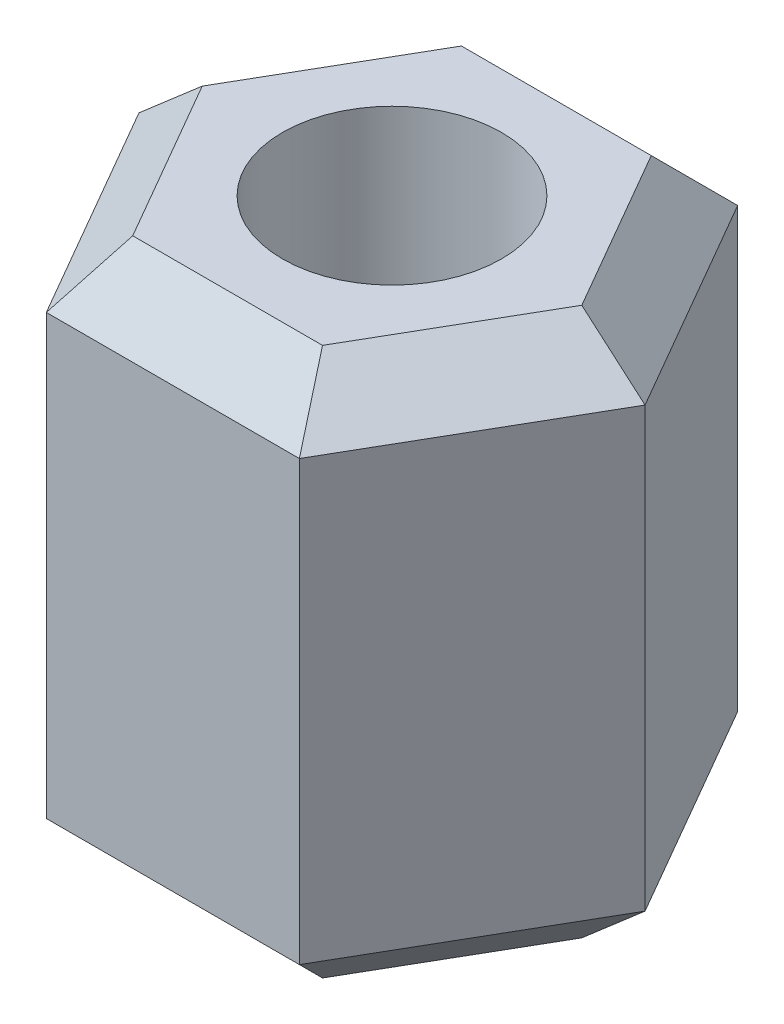
ISO-10303-21;
HEADER;
FILE_DESCRIPTION(('STEP AP214'),'2;1');
FILE_NAME('part.step','',(''),(''),'','','');
FILE_SCHEMA(('AUTOMOTIVE_DESIGN { 1 0 10303 214 1 1 1 1 }'));
ENDSEC;
DATA;
#1=APPLICATION_CONTEXT('core data for automotive mechanical design processes');
#2=APPLICATION_PROTOCOL_DEFINITION('international standard','automotive_design',2000,#1);
#3=PRODUCT_CONTEXT('',#1,'mechanical');
#4=PRODUCT('Part','Part','',(#3));
#5=PRODUCT_RELATED_PRODUCT_CATEGORY('part','',(#4));
#6=PRODUCT_DEFINITION_FORMATION('','',#4);
#7=PRODUCT_DEFINITION_CONTEXT('part definition',#1,'design');
#8=PRODUCT_DEFINITION('design','',#6,#7);
#9=PRODUCT_DEFINITION_SHAPE('','',#8);
#10=(LENGTH_UNIT() NAMED_UNIT(*) SI_UNIT(.MILLI.,.METRE.));
#11=(NAMED_UNIT(*) PLANE_ANGLE_UNIT() SI_UNIT($,.RADIAN.));
#12=(NAMED_UNIT(*) SI_UNIT($,.STERADIAN.) SOLID_ANGLE_UNIT());
#13=UNCERTAINTY_MEASURE_WITH_UNIT(LENGTH_MEASURE(1.E-05),#10,'distance_accuracy_value','');
#14=(GEOMETRIC_REPRESENTATION_CONTEXT(3) GLOBAL_UNCERTAINTY_ASSIGNED_CONTEXT((#13)) GLOBAL_UNIT_ASSIGNED_CONTEXT((#10,
#11,#12)) REPRESENTATION_CONTEXT('',''));
#15=CARTESIAN_POINT('',(0.,0.,0.));
#16=DIRECTION('',(0.,0.,1.));
#17=DIRECTION('',(1.,0.,0.));
#18=AXIS2_PLACEMENT_3D('',#15,#16,#17);
#19=CARTESIAN_POINT('',(0.,5.,0.));
#20=DIRECTION('',(0.,1.,0.));
#21=DIRECTION('',(0.,0.,1.));
#22=AXIS2_PLACEMENT_3D('',#19,#20,#21);
#23=PLANE('',#22);
#24=DIRECTION('',(0.5,0.,-0.866025403784439));
#25=VECTOR('',#24,1.);
#26=CARTESIAN_POINT('',(1.8763883748663,5.,-0.25));
#27=LINE('',#26,#25);
#28=CARTESIAN_POINT('',(0.866025403784449,5.,1.50000000000002));
#29=VERTEX_POINT('',#28);
#30=CARTESIAN_POINT('',(1.7320508075689,5.,0.));
#31=VERTEX_POINT('',#30);
#32=EDGE_CURVE('E203',#29,#31,#27,.T.);
#33=ORIENTED_EDGE('',*,*,#32,.T.);
#34=DIRECTION('',(-0.5,0.,-0.866025403784439));
#35=VECTOR('',#34,1.);
#36=CARTESIAN_POINT('',(0.721687836487043,5.,-1.75000000000002));
#37=LINE('',#36,#35);
#38=CARTESIAN_POINT('',(0.866025403784449,5.,-1.50000000000002));
#39=VERTEX_POINT('',#38);
#40=EDGE_CURVE('E11',#31,#39,#37,.T.);
#41=ORIENTED_EDGE('',*,*,#40,.T.);
#42=DIRECTION('',(-1.,0.,0.));
#43=VECTOR('',#42,1.);
#44=CARTESIAN_POINT('',(-1.15470053837926,5.,-1.50000000000002));
#45=LINE('',#44,#43);
#46=CARTESIAN_POINT('',(-0.866025403784449,5.,-1.50000000000002));
#47=VERTEX_POINT('',#46);
#48=EDGE_CURVE('E47',#39,#47,#45,.T.);
#49=ORIENTED_EDGE('',*,*,#48,.T.);
#50=DIRECTION('',(-0.5,0.,0.866025403784439));
#51=VECTOR('',#50,1.);
#52=CARTESIAN_POINT('',(-1.8763883748663,5.,0.25));
#53=LINE('',#52,#51);
#54=CARTESIAN_POINT('',(-1.7320508075689,5.,0.));
#55=VERTEX_POINT('',#54);
#56=EDGE_CURVE('E209',#47,#55,#53,.T.);
#57=ORIENTED_EDGE('',*,*,#56,.T.);
#58=DIRECTION('',(0.5,0.,0.866025403784439));
#59=VECTOR('',#58,1.);
#60=CARTESIAN_POINT('',(-0.721687836487042,5.,1.75000000000002));
#61=LINE('',#60,#59);
#62=CARTESIAN_POINT('',(-0.866025403784448,5.,1.50000000000002));
#63=VERTEX_POINT('',#62);
#64=EDGE_CURVE('E207',#55,#63,#61,.T.);
#65=ORIENTED_EDGE('',*,*,#64,.T.);
#66=DIRECTION('',(1.,0.,0.));
#67=VECTOR('',#66,1.);
#68=CARTESIAN_POINT('',(1.15470053837926,5.,1.50000000000002));
#69=LINE('',#68,#67);
#70=EDGE_CURVE('E205',#63,#29,#69,.T.);
#71=ORIENTED_EDGE('',*,*,#70,.T.);
#72=EDGE_LOOP('',(#33,#41,#49,#57,#65,#71));
#73=FACE_BOUND('',#72,.T.);
#74=CARTESIAN_POINT('',(0.,5.,0.));
#75=DIRECTION('',(0.,1.,0.));
#76=DIRECTION('',(0.,0.,1.));
#77=AXIS2_PLACEMENT_3D('',#74,#75,#76);
#78=CIRCLE('',#77,1.);
#79=CARTESIAN_POINT('',(0.,5.,1.));
#80=VERTEX_POINT('',#79);
#81=EDGE_CURVE('E502',#80,#80,#78,.T.);
#82=ORIENTED_EDGE('',*,*,#81,.F.);
#83=EDGE_LOOP('',(#82));
#84=FACE_BOUND('',#83,.T.);
#85=ADVANCED_FACE('F37',(#73,#84),#23,.T.);
#86=CARTESIAN_POINT('',(0.,0.,0.));
#87=DIRECTION('',(0.,1.,0.));
#88=DIRECTION('',(0.,0.,1.));
#89=AXIS2_PLACEMENT_3D('',#86,#87,#88);
#90=PLANE('',#89);
#91=DIRECTION('',(0.5,0.,0.866025403784439));
#92=VECTOR('',#91,1.);
#93=CARTESIAN_POINT('',(1.29903810567667,0.,-0.750000000000009));
#94=LINE('',#93,#92);
#95=CARTESIAN_POINT('',(0.866025403784449,0.,-1.50000000000002));
#96=VERTEX_POINT('',#95);
#97=CARTESIAN_POINT('',(1.7320508075689,0.,0.));
#98=VERTEX_POINT('',#97);
#99=EDGE_CURVE('E174',#96,#98,#94,.T.);
#100=ORIENTED_EDGE('',*,*,#99,.T.);
#101=DIRECTION('',(-0.5,0.,0.866025403784439));
#102=VECTOR('',#101,1.);
#103=CARTESIAN_POINT('',(1.29903810567667,0.,0.750000000000008));
#104=LINE('',#103,#102);
#105=CARTESIAN_POINT('',(0.866025403784449,0.,1.50000000000002));
#106=VERTEX_POINT('',#105);
#107=EDGE_CURVE('E184',#98,#106,#104,.T.);
#108=ORIENTED_EDGE('',*,*,#107,.T.);
#109=DIRECTION('',(-1.,0.,0.));
#110=VECTOR('',#109,1.);
#111=CARTESIAN_POINT('',(0.,0.,1.50000000000002));
#112=LINE('',#111,#110);
#113=CARTESIAN_POINT('',(-0.866025403784449,0.,1.50000000000002));
#114=VERTEX_POINT('',#113);
#115=EDGE_CURVE('E182',#106,#114,#112,.T.);
#116=ORIENTED_EDGE('',*,*,#115,.T.);
#117=DIRECTION('',(-0.5,0.,-0.866025403784439));
#118=VECTOR('',#117,1.);
#119=CARTESIAN_POINT('',(-1.29903810567667,0.,0.750000000000009));
#120=LINE('',#119,#118);
#121=CARTESIAN_POINT('',(-1.7320508075689,0.,0.));
#122=VERTEX_POINT('',#121);
#123=EDGE_CURVE('E180',#114,#122,#120,.T.);
#124=ORIENTED_EDGE('',*,*,#123,.T.);
#125=DIRECTION('',(0.5,0.,-0.866025403784439));
#126=VECTOR('',#125,1.);
#127=CARTESIAN_POINT('',(-1.29903810567667,0.,-0.750000000000008));
#128=LINE('',#127,#126);
#129=CARTESIAN_POINT('',(-0.866025403784449,0.,-1.50000000000002));
#130=VERTEX_POINT('',#129);
#131=EDGE_CURVE('E178',#122,#130,#128,.T.);
#132=ORIENTED_EDGE('',*,*,#131,.T.);
#133=DIRECTION('',(1.,0.,0.));
#134=VECTOR('',#133,1.);
#135=CARTESIAN_POINT('',(0.,0.,-1.50000000000002));
#136=LINE('',#135,#134);
#137=EDGE_CURVE('E176',#130,#96,#136,.T.);
#138=ORIENTED_EDGE('',*,*,#137,.T.);
#139=EDGE_LOOP('',(#100,#108,#116,#124,#132,#138));
#140=FACE_BOUND('',#139,.T.);
#141=CARTESIAN_POINT('',(0.,0.,0.));
#142=DIRECTION('',(0.,1.,0.));
#143=DIRECTION('',(0.,0.,1.));
#144=AXIS2_PLACEMENT_3D('',#141,#142,#143);
#145=CIRCLE('',#144,1.);
#146=CARTESIAN_POINT('',(0.,0.,1.));
#147=VERTEX_POINT('',#146);
#148=EDGE_CURVE('E228',#147,#147,#145,.T.);
#149=ORIENTED_EDGE('',*,*,#148,.T.);
#150=EDGE_LOOP('',(#149));
#151=FACE_BOUND('',#150,.T.);
#152=ADVANCED_FACE('F268',(#140,#151),#90,.F.);
#153=CARTESIAN_POINT('',(-1.15470053837926,5.,-2.00000000000002));
#154=DIRECTION('',(0.866025403784439,0.,0.5));
#155=DIRECTION('',(0.5,0.,-0.866025403784439));
#156=AXIS2_PLACEMENT_3D('',#153,#154,#155);
#157=PLANE('',#156);
#158=DIRECTION('',(0.,-1.,0.));
#159=VECTOR('',#158,1.);
#160=CARTESIAN_POINT('',(-1.15470053837926,5.,-2.00000000000002));
#161=LINE('',#160,#159);
#162=CARTESIAN_POINT('',(-1.15470053837926,4.5,-2.00000000000002));
#163=VERTEX_POINT('',#162);
#164=CARTESIAN_POINT('',(-1.15470053837926,0.499999999999999,-2.00000000000002));
#165=VERTEX_POINT('',#164);
#166=EDGE_CURVE('E165',#163,#165,#161,.T.);
#167=ORIENTED_EDGE('',*,*,#166,.T.);
#168=DIRECTION('',(-0.5,0.,0.866025403784439));
#169=VECTOR('',#168,1.);
#170=CARTESIAN_POINT('',(-1.15470053837926,0.499999999999999,-2.00000000000002));
#171=LINE('',#170,#169);
#172=CARTESIAN_POINT('',(-2.30940107675852,0.499999999999999,0.));
#173=VERTEX_POINT('',#172);
#174=EDGE_CURVE('E197',#165,#173,#171,.T.);
#175=ORIENTED_EDGE('',*,*,#174,.T.);
#176=DIRECTION('',(0.,-1.,0.));
#177=VECTOR('',#176,1.);
#178=CARTESIAN_POINT('',(-2.30940107675852,5.,0.));
#179=LINE('',#178,#177);
#180=CARTESIAN_POINT('',(-2.30940107675852,4.5,0.));
#181=VERTEX_POINT('',#180);
#182=EDGE_CURVE('E146',#181,#173,#179,.T.);
#183=ORIENTED_EDGE('',*,*,#182,.F.);
#184=DIRECTION('',(0.5,0.,-0.866025403784439));
#185=VECTOR('',#184,1.);
#186=CARTESIAN_POINT('',(-1.15470053837926,4.5,-2.00000000000002));
#187=LINE('',#186,#185);
#188=EDGE_CURVE('E195',#181,#163,#187,.T.);
#189=ORIENTED_EDGE('',*,*,#188,.T.);
#190=EDGE_LOOP('',(#167,#175,#183,#189));
#191=FACE_BOUND('',#190,.T.);
#192=ADVANCED_FACE('F253',(#191),#157,.F.);
#193=CARTESIAN_POINT('',(-2.30940107675852,5.,0.));
#194=DIRECTION('',(0.866025403784438,0.,-0.5));
#195=DIRECTION('',(-0.5,0.,-0.866025403784439));
#196=AXIS2_PLACEMENT_3D('',#193,#194,#195);
#197=PLANE('',#196);
#198=ORIENTED_EDGE('',*,*,#182,.T.);
#199=DIRECTION('',(0.5,0.,0.866025403784439));
#200=VECTOR('',#199,1.);
#201=CARTESIAN_POINT('',(-2.30940107675852,0.499999999999999,0.));
#202=LINE('',#201,#200);
#203=CARTESIAN_POINT('',(-1.15470053837926,0.499999999999999,2.00000000000002));
#204=VERTEX_POINT('',#203);
#205=EDGE_CURVE('E193',#173,#204,#202,.T.);
#206=ORIENTED_EDGE('',*,*,#205,.T.);
#207=DIRECTION('',(0.,-1.,0.));
#208=VECTOR('',#207,1.);
#209=CARTESIAN_POINT('',(-1.15470053837926,5.,2.00000000000002));
#210=LINE('',#209,#208);
#211=CARTESIAN_POINT('',(-1.15470053837926,4.5,2.00000000000002));
#212=VERTEX_POINT('',#211);
#213=EDGE_CURVE('E163',#212,#204,#210,.T.);
#214=ORIENTED_EDGE('',*,*,#213,.F.);
#215=DIRECTION('',(-0.5,0.,-0.866025403784439));
#216=VECTOR('',#215,1.);
#217=CARTESIAN_POINT('',(-2.30940107675852,4.5,0.));
#218=LINE('',#217,#216);
#219=EDGE_CURVE('E191',#212,#181,#218,.T.);
#220=ORIENTED_EDGE('',*,*,#219,.T.);
#221=EDGE_LOOP('',(#198,#206,#214,#220));
#222=FACE_BOUND('',#221,.T.);
#223=ADVANCED_FACE('F249',(#222),#197,.F.);
#224=CARTESIAN_POINT('',(-1.15470053837926,5.,2.00000000000002));
#225=DIRECTION('',(0.,0.,-1.));
#226=DIRECTION('',(-1.,0.,0.));
#227=AXIS2_PLACEMENT_3D('',#224,#225,#226);
#228=PLANE('',#227);
#229=ORIENTED_EDGE('',*,*,#213,.T.);
#230=DIRECTION('',(1.,0.,0.));
#231=VECTOR('',#230,1.);
#232=CARTESIAN_POINT('',(-1.15470053837926,0.499999999999999,2.00000000000002));
#233=LINE('',#232,#231);
#234=CARTESIAN_POINT('',(1.15470053837926,0.499999999999999,2.00000000000002));
#235=VERTEX_POINT('',#234);
#236=EDGE_CURVE('E189',#204,#235,#233,.T.);
#237=ORIENTED_EDGE('',*,*,#236,.T.);
#238=DIRECTION('',(0.,-1.,0.));
#239=VECTOR('',#238,1.);
#240=CARTESIAN_POINT('',(1.15470053837926,5.,2.00000000000002));
#241=LINE('',#240,#239);
#242=CARTESIAN_POINT('',(1.15470053837926,4.5,2.00000000000002));
#243=VERTEX_POINT('',#242);
#244=EDGE_CURVE('E161',#243,#235,#241,.T.);
#245=ORIENTED_EDGE('',*,*,#244,.F.);
#246=DIRECTION('',(-1.,0.,0.));
#247=VECTOR('',#246,1.);
#248=CARTESIAN_POINT('',(-1.15470053837926,4.5,2.00000000000002));
#249=LINE('',#248,#247);
#250=EDGE_CURVE('E187',#243,#212,#249,.T.);
#251=ORIENTED_EDGE('',*,*,#250,.T.);
#252=EDGE_LOOP('',(#229,#237,#245,#251));
#253=FACE_BOUND('',#252,.T.);
#254=ADVANCED_FACE('F277',(#253),#228,.F.);
#255=CARTESIAN_POINT('',(1.15470053837926,5.,2.00000000000002));
#256=DIRECTION('',(-0.866025403784439,0.,-0.5));
#257=DIRECTION('',(-0.5,0.,0.866025403784439));
#258=AXIS2_PLACEMENT_3D('',#255,#256,#257);
#259=PLANE('',#258);
#260=ORIENTED_EDGE('',*,*,#244,.T.);
#261=DIRECTION('',(0.5,0.,-0.866025403784439));
#262=VECTOR('',#261,1.);
#263=CARTESIAN_POINT('',(1.15470053837926,0.499999999999999,2.00000000000002));
#264=LINE('',#263,#262);
#265=CARTESIAN_POINT('',(2.30940107675852,0.499999999999999,0.));
#266=VERTEX_POINT('',#265);
#267=EDGE_CURVE('E145',#235,#266,#264,.T.);
#268=ORIENTED_EDGE('',*,*,#267,.T.);
#269=DIRECTION('',(0.,-1.,0.));
#270=VECTOR('',#269,1.);
#271=CARTESIAN_POINT('',(2.30940107675852,5.,0.));
#272=LINE('',#271,#270);
#273=CARTESIAN_POINT('',(2.30940107675852,4.5,0.));
#274=VERTEX_POINT('',#273);
#275=EDGE_CURVE('E152',#274,#266,#272,.T.);
#276=ORIENTED_EDGE('',*,*,#275,.F.);
#277=DIRECTION('',(-0.5,0.,0.866025403784439));
#278=VECTOR('',#277,1.);
#279=CARTESIAN_POINT('',(1.15470053837926,4.5,2.00000000000002));
#280=LINE('',#279,#278);
#281=EDGE_CURVE('E137',#274,#243,#280,.T.);
#282=ORIENTED_EDGE('',*,*,#281,.T.);
#283=EDGE_LOOP('',(#260,#268,#276,#282));
#284=FACE_BOUND('',#283,.T.);
#285=ADVANCED_FACE('F159',(#284),#259,.F.);
#286=CARTESIAN_POINT('',(2.30940107675852,5.,0.));
#287=DIRECTION('',(-0.866025403784439,0.,0.5));
#288=DIRECTION('',(0.5,0.,0.866025403784439));
#289=AXIS2_PLACEMENT_3D('',#286,#287,#288);
#290=PLANE('',#289);
#291=ORIENTED_EDGE('',*,*,#275,.T.);
#292=DIRECTION('',(-0.5,0.,-0.866025403784439));
#293=VECTOR('',#292,1.);
#294=CARTESIAN_POINT('',(2.30940107675852,0.499999999999999,0.));
#295=LINE('',#294,#293);
#296=CARTESIAN_POINT('',(1.15470053837926,0.499999999999999,-2.00000000000002));
#297=VERTEX_POINT('',#296);
#298=EDGE_CURVE('E155',#266,#297,#295,.T.);
#299=ORIENTED_EDGE('',*,*,#298,.T.);
#300=DIRECTION('',(0.,-1.,0.));
#301=VECTOR('',#300,1.);
#302=CARTESIAN_POINT('',(1.15470053837926,5.,-2.00000000000002));
#303=LINE('',#302,#301);
#304=CARTESIAN_POINT('',(1.15470053837926,4.5,-2.00000000000002));
#305=VERTEX_POINT('',#304);
#306=EDGE_CURVE('E154',#305,#297,#303,.T.);
#307=ORIENTED_EDGE('',*,*,#306,.F.);
#308=DIRECTION('',(0.5,0.,0.866025403784439));
#309=VECTOR('',#308,1.);
#310=CARTESIAN_POINT('',(2.30940107675852,4.5,0.));
#311=LINE('',#310,#309);
#312=EDGE_CURVE('E131',#305,#274,#311,.T.);
#313=ORIENTED_EDGE('',*,*,#312,.T.);
#314=EDGE_LOOP('',(#291,#299,#307,#313));
#315=FACE_BOUND('',#314,.T.);
#316=ADVANCED_FACE('F151',(#315),#290,.F.);
#317=CARTESIAN_POINT('',(1.15470053837926,5.,-2.00000000000002));
#318=DIRECTION('',(0.,0.,1.));
#319=DIRECTION('',(1.,0.,0.));
#320=AXIS2_PLACEMENT_3D('',#317,#318,#319);
#321=PLANE('',#320);
#322=ORIENTED_EDGE('',*,*,#306,.T.);
#323=DIRECTION('',(-1.,0.,0.));
#324=VECTOR('',#323,1.);
#325=CARTESIAN_POINT('',(1.15470053837926,0.499999999999999,-2.00000000000002));
#326=LINE('',#325,#324);
#327=EDGE_CURVE('E156',#297,#165,#326,.T.);
#328=ORIENTED_EDGE('',*,*,#327,.T.);
#329=ORIENTED_EDGE('',*,*,#166,.F.);
#330=DIRECTION('',(1.,0.,0.));
#331=VECTOR('',#330,1.);
#332=CARTESIAN_POINT('',(1.15470053837926,4.5,-2.00000000000002));
#333=LINE('',#332,#331);
#334=EDGE_CURVE('E199',#163,#305,#333,.T.);
#335=ORIENTED_EDGE('',*,*,#334,.T.);
#336=EDGE_LOOP('',(#322,#328,#329,#335));
#337=FACE_BOUND('',#336,.T.);
#338=ADVANCED_FACE('F289',(#337),#321,.F.);
#339=CARTESIAN_POINT('',(0.,5.,0.));
#340=DIRECTION('',(0.,-1.,0.));
#341=DIRECTION('',(0.,0.,-1.));
#342=AXIS2_PLACEMENT_3D('',#339,#340,#341);
#343=CYLINDRICAL_SURFACE('',#342,1.);
#344=ORIENTED_EDGE('',*,*,#81,.T.);
#345=EDGE_LOOP('',(#344));
#346=FACE_BOUND('',#345,.T.);
#347=ORIENTED_EDGE('',*,*,#148,.F.);
#348=EDGE_LOOP('',(#347));
#349=FACE_BOUND('',#348,.T.);
#350=ADVANCED_FACE('F311',(#346,#349),#343,.F.);
#351=CARTESIAN_POINT('',(-1.15470053837926,0.499999999999999,-2.00000000000002));
#352=DIRECTION('',(0.612372435695794,0.707106781186548,0.353553390593273));
#353=DIRECTION('',(-0.5,0.,0.866025403784439));
#354=AXIS2_PLACEMENT_3D('',#351,#352,#353);
#355=PLANE('',#354);
#356=DIRECTION('',(-0.377964473009228,0.654653670707976,-0.654653670707978));
#357=VECTOR('',#356,1.);
#358=CARTESIAN_POINT('',(-0.824786098842329,-0.0714285714285782,-1.42857142857144));
#359=LINE('',#358,#357);
#360=EDGE_CURVE('E222',#130,#165,#359,.T.);
#361=ORIENTED_EDGE('',*,*,#360,.F.);
#362=ORIENTED_EDGE('',*,*,#131,.F.);
#363=DIRECTION('',(-0.755928946018455,0.654653670707976,0.));
#364=VECTOR('',#363,1.);
#365=CARTESIAN_POINT('',(-1.64957219768466,-0.0714285714285776,0.));
#366=LINE('',#365,#364);
#367=EDGE_CURVE('E225',#173,#122,#366,.F.);
#368=ORIENTED_EDGE('',*,*,#367,.F.);
#369=ORIENTED_EDGE('',*,*,#174,.F.);
#370=EDGE_LOOP('',(#361,#362,#368,#369));
#371=FACE_BOUND('',#370,.T.);
#372=ADVANCED_FACE('F258',(#371),#355,.F.);
#373=CARTESIAN_POINT('',(-2.30940107675852,0.499999999999999,0.));
#374=DIRECTION('',(0.612372435695794,0.707106781186548,-0.353553390593274));
#375=DIRECTION('',(0.5,0.,0.866025403784439));
#376=AXIS2_PLACEMENT_3D('',#373,#374,#375);
#377=PLANE('',#376);
#378=ORIENTED_EDGE('',*,*,#367,.T.);
#379=ORIENTED_EDGE('',*,*,#123,.F.);
#380=DIRECTION('',(-0.377964473009227,0.654653670707976,0.654653670707978));
#381=VECTOR('',#380,1.);
#382=CARTESIAN_POINT('',(-0.824786098842329,-0.071428571428577,1.42857142857144));
#383=LINE('',#382,#381);
#384=EDGE_CURVE('E219',#204,#114,#383,.F.);
#385=ORIENTED_EDGE('',*,*,#384,.F.);
#386=ORIENTED_EDGE('',*,*,#205,.F.);
#387=EDGE_LOOP('',(#378,#379,#385,#386));
#388=FACE_BOUND('',#387,.T.);
#389=ADVANCED_FACE('F273',(#388),#377,.F.);
#390=CARTESIAN_POINT('',(1.15470053837926,0.499999999999999,-2.00000000000002));
#391=DIRECTION('',(0.,0.707106781186548,0.707106781186547));
#392=DIRECTION('',(-1.,0.,0.));
#393=AXIS2_PLACEMENT_3D('',#390,#391,#392);
#394=PLANE('',#393);
#395=ORIENTED_EDGE('',*,*,#360,.T.);
#396=ORIENTED_EDGE('',*,*,#327,.F.);
#397=DIRECTION('',(0.377964473009227,0.654653670707977,-0.654653670707978));
#398=VECTOR('',#397,1.);
#399=CARTESIAN_POINT('',(0.824786098842329,-0.0714285714285775,-1.42857142857144));
#400=LINE('',#399,#398);
#401=EDGE_CURVE('E216',#96,#297,#400,.T.);
#402=ORIENTED_EDGE('',*,*,#401,.F.);
#403=ORIENTED_EDGE('',*,*,#137,.F.);
#404=EDGE_LOOP('',(#395,#396,#402,#403));
#405=FACE_BOUND('',#404,.T.);
#406=ADVANCED_FACE('F264',(#405),#394,.F.);
#407=CARTESIAN_POINT('',(-1.15470053837926,0.499999999999999,2.00000000000002));
#408=DIRECTION('',(0.,0.707106781186548,-0.707106781186547));
#409=DIRECTION('',(1.,0.,0.));
#410=AXIS2_PLACEMENT_3D('',#407,#408,#409);
#411=PLANE('',#410);
#412=ORIENTED_EDGE('',*,*,#384,.T.);
#413=ORIENTED_EDGE('',*,*,#115,.F.);
#414=DIRECTION('',(0.377964473009228,0.654653670707977,0.654653670707978));
#415=VECTOR('',#414,1.);
#416=CARTESIAN_POINT('',(0.824786098842329,-0.0714285714285776,1.42857142857144));
#417=LINE('',#416,#415);
#418=EDGE_CURVE('E214',#235,#106,#417,.F.);
#419=ORIENTED_EDGE('',*,*,#418,.F.);
#420=ORIENTED_EDGE('',*,*,#236,.F.);
#421=EDGE_LOOP('',(#412,#413,#419,#420));
#422=FACE_BOUND('',#421,.T.);
#423=ADVANCED_FACE('F281',(#422),#411,.F.);
#424=CARTESIAN_POINT('',(2.30940107675852,0.499999999999999,0.));
#425=DIRECTION('',(-0.612372435695794,0.707106781186548,0.353553390593274));
#426=DIRECTION('',(-0.5,0.,-0.866025403784439));
#427=AXIS2_PLACEMENT_3D('',#424,#425,#426);
#428=PLANE('',#427);
#429=ORIENTED_EDGE('',*,*,#401,.T.);
#430=ORIENTED_EDGE('',*,*,#298,.F.);
#431=DIRECTION('',(-0.755928946018455,-0.654653670707977,0.));
#432=VECTOR('',#431,1.);
#433=CARTESIAN_POINT('',(2.30940107675852,0.499999999999999,0.));
#434=LINE('',#433,#432);
#435=EDGE_CURVE('E212',#98,#266,#434,.F.);
#436=ORIENTED_EDGE('',*,*,#435,.F.);
#437=ORIENTED_EDGE('',*,*,#99,.F.);
#438=EDGE_LOOP('',(#429,#430,#436,#437));
#439=FACE_BOUND('',#438,.T.);
#440=ADVANCED_FACE('F287',(#439),#428,.F.);
#441=CARTESIAN_POINT('',(1.15470053837926,0.499999999999999,2.00000000000002));
#442=DIRECTION('',(-0.612372435695794,0.707106781186548,-0.353553390593273));
#443=DIRECTION('',(0.5,0.,-0.866025403784439));
#444=AXIS2_PLACEMENT_3D('',#441,#442,#443);
#445=PLANE('',#444);
#446=ORIENTED_EDGE('',*,*,#418,.T.);
#447=ORIENTED_EDGE('',*,*,#107,.F.);
#448=ORIENTED_EDGE('',*,*,#435,.T.);
#449=ORIENTED_EDGE('',*,*,#267,.F.);
#450=EDGE_LOOP('',(#446,#447,#448,#449));
#451=FACE_BOUND('',#450,.T.);
#452=ADVANCED_FACE('F283',(#451),#445,.F.);
#453=CARTESIAN_POINT('',(-1.29903810567667,5.,0.750000000000009));
#454=DIRECTION('',(-0.612372435695795,0.707106781186547,0.353553390593274));
#455=DIRECTION('',(-0.5,0.,-0.866025403784439));
#456=AXIS2_PLACEMENT_3D('',#453,#454,#455);
#457=PLANE('',#456);
#458=DIRECTION('',(-0.755928946018454,-0.654653670707978,0.));
#459=VECTOR('',#458,1.);
#460=CARTESIAN_POINT('',(-1.4846149779162,5.21428571428572,0.));
#461=LINE('',#460,#459);
#462=EDGE_CURVE('E232',#181,#55,#461,.F.);
#463=ORIENTED_EDGE('',*,*,#462,.F.);
#464=ORIENTED_EDGE('',*,*,#219,.F.);
#465=DIRECTION('',(-0.377964473009227,-0.654653670707978,0.654653670707976));
#466=VECTOR('',#465,1.);
#467=CARTESIAN_POINT('',(-0.742307488958098,5.21428571428572,1.2857142857143));
#468=LINE('',#467,#466);
#469=EDGE_CURVE('E42',#63,#212,#468,.T.);
#470=ORIENTED_EDGE('',*,*,#469,.F.);
#471=ORIENTED_EDGE('',*,*,#64,.F.);
#472=EDGE_LOOP('',(#463,#464,#470,#471));
#473=FACE_BOUND('',#472,.T.);
#474=ADVANCED_FACE('F40',(#473),#457,.T.);
#475=CARTESIAN_POINT('',(0.,5.,1.50000000000002));
#476=DIRECTION('',(0.,0.707106781186547,0.707106781186548));
#477=DIRECTION('',(-1.,0.,0.));
#478=AXIS2_PLACEMENT_3D('',#475,#476,#477);
#479=PLANE('',#478);
#480=ORIENTED_EDGE('',*,*,#469,.T.);
#481=ORIENTED_EDGE('',*,*,#250,.F.);
#482=DIRECTION('',(0.377964473009227,-0.654653670707978,0.654653670707976));
#483=VECTOR('',#482,1.);
#484=CARTESIAN_POINT('',(0.742307488958099,5.21428571428572,1.2857142857143));
#485=LINE('',#484,#483);
#486=EDGE_CURVE('E140',#29,#243,#485,.T.);
#487=ORIENTED_EDGE('',*,*,#486,.F.);
#488=ORIENTED_EDGE('',*,*,#70,.F.);
#489=EDGE_LOOP('',(#480,#481,#487,#488));
#490=FACE_BOUND('',#489,.T.);
#491=ADVANCED_FACE('F242',(#490),#479,.T.);
#492=CARTESIAN_POINT('',(-1.29903810567667,5.,-0.750000000000009));
#493=DIRECTION('',(-0.612372435695795,0.707106781186547,-0.353553390593274));
#494=DIRECTION('',(0.5,0.,-0.866025403784439));
#495=AXIS2_PLACEMENT_3D('',#492,#493,#494);
#496=PLANE('',#495);
#497=ORIENTED_EDGE('',*,*,#462,.T.);
#498=ORIENTED_EDGE('',*,*,#56,.F.);
#499=DIRECTION('',(-0.377964473009227,-0.654653670707978,-0.654653670707976));
#500=VECTOR('',#499,1.);
#501=CARTESIAN_POINT('',(-0.742307488958099,5.21428571428572,-1.2857142857143));
#502=LINE('',#501,#500);
#503=EDGE_CURVE('E134',#163,#47,#502,.F.);
#504=ORIENTED_EDGE('',*,*,#503,.F.);
#505=ORIENTED_EDGE('',*,*,#188,.F.);
#506=EDGE_LOOP('',(#497,#498,#504,#505));
#507=FACE_BOUND('',#506,.T.);
#508=ADVANCED_FACE('F295',(#507),#496,.T.);
#509=CARTESIAN_POINT('',(1.29903810567667,5.,0.750000000000008));
#510=DIRECTION('',(0.612372435695795,0.707106781186547,0.353553390593274));
#511=DIRECTION('',(-0.5,0.,0.866025403784439));
#512=AXIS2_PLACEMENT_3D('',#509,#510,#511);
#513=PLANE('',#512);
#514=ORIENTED_EDGE('',*,*,#486,.T.);
#515=ORIENTED_EDGE('',*,*,#281,.F.);
#516=DIRECTION('',(-0.755928946018454,0.654653670707978,0.));
#517=VECTOR('',#516,1.);
#518=CARTESIAN_POINT('',(1.4846149779162,5.21428571428572,0.));
#519=LINE('',#518,#517);
#520=EDGE_CURVE('E127',#31,#274,#519,.F.);
#521=ORIENTED_EDGE('',*,*,#520,.F.);
#522=ORIENTED_EDGE('',*,*,#32,.F.);
#523=EDGE_LOOP('',(#514,#515,#521,#522));
#524=FACE_BOUND('',#523,.T.);
#525=ADVANCED_FACE('F138',(#524),#513,.T.);
#526=CARTESIAN_POINT('',(0.,5.,-1.50000000000002));
#527=DIRECTION('',(0.,0.707106781186547,-0.707106781186548));
#528=DIRECTION('',(1.,0.,0.));
#529=AXIS2_PLACEMENT_3D('',#526,#527,#528);
#530=PLANE('',#529);
#531=ORIENTED_EDGE('',*,*,#503,.T.);
#532=ORIENTED_EDGE('',*,*,#48,.F.);
#533=DIRECTION('',(0.377964473009227,-0.654653670707978,-0.654653670707976));
#534=VECTOR('',#533,1.);
#535=CARTESIAN_POINT('',(0.742307488958099,5.21428571428572,-1.2857142857143));
#536=LINE('',#535,#534);
#537=EDGE_CURVE('E55',#305,#39,#536,.F.);
#538=ORIENTED_EDGE('',*,*,#537,.F.);
#539=ORIENTED_EDGE('',*,*,#334,.F.);
#540=EDGE_LOOP('',(#531,#532,#538,#539));
#541=FACE_BOUND('',#540,.T.);
#542=ADVANCED_FACE('F293',(#541),#530,.T.);
#543=CARTESIAN_POINT('',(1.29903810567667,5.,-0.750000000000009));
#544=DIRECTION('',(0.612372435695795,0.707106781186547,-0.353553390593274));
#545=DIRECTION('',(0.5,0.,0.866025403784439));
#546=AXIS2_PLACEMENT_3D('',#543,#544,#545);
#547=PLANE('',#546);
#548=ORIENTED_EDGE('',*,*,#520,.T.);
#549=ORIENTED_EDGE('',*,*,#312,.F.);
#550=ORIENTED_EDGE('',*,*,#537,.T.);
#551=ORIENTED_EDGE('',*,*,#40,.F.);
#552=EDGE_LOOP('',(#548,#549,#550,#551));
#553=FACE_BOUND('',#552,.T.);
#554=ADVANCED_FACE('F129',(#553),#547,.T.);
#555=CLOSED_SHELL('',(#85,#152,#192,#223,#254,#285,#316,#338,#350,#372,#389,#406,#423,#440,#452,
#474,#491,#508,#525,#542,#554));
#556=MANIFOLD_SOLID_BREP('B2',#555);
#557=ADVANCED_BREP_SHAPE_REPRESENTATION('',(#18,#556),#14);
#558=SHAPE_DEFINITION_REPRESENTATION(#9,#557);
ENDSEC;
END-ISO-10303-21;
